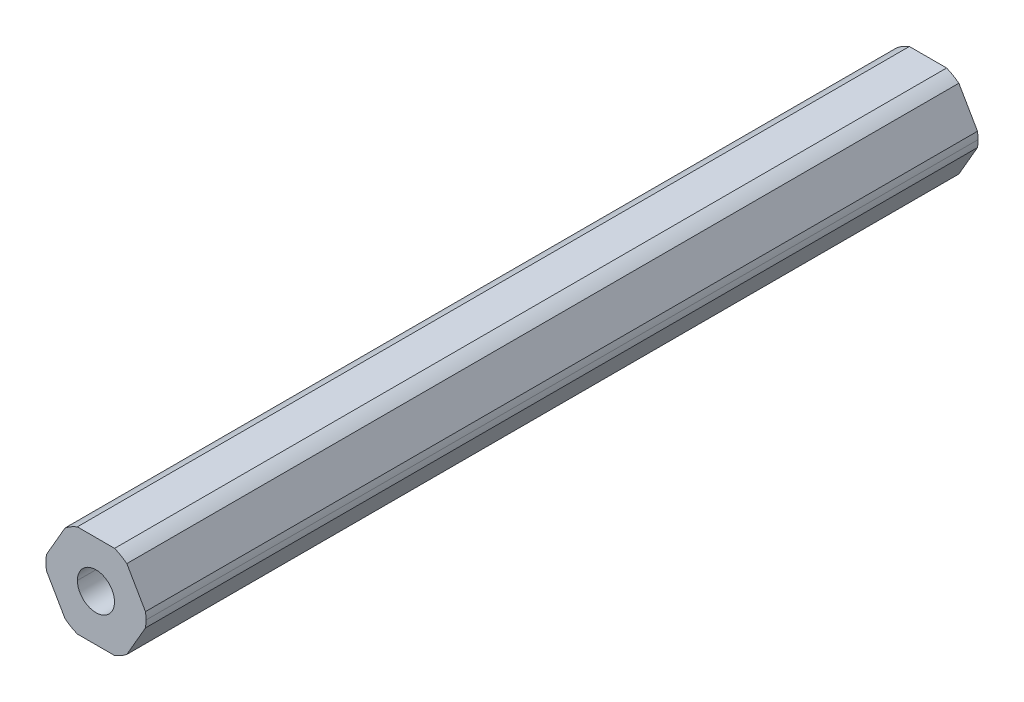
ISO-10303-21;
HEADER;
FILE_DESCRIPTION(('STEP AP214'),'2;1');
FILE_NAME('part.step','',(''),(''),'','','');
FILE_SCHEMA(('AUTOMOTIVE_DESIGN { 1 0 10303 214 1 1 1 1 }'));
ENDSEC;
DATA;
#1=APPLICATION_CONTEXT('core data for automotive mechanical design processes');
#2=APPLICATION_PROTOCOL_DEFINITION('international standard','automotive_design',2000,#1);
#3=PRODUCT_CONTEXT('',#1,'mechanical');
#4=PRODUCT('Part','Part','',(#3));
#5=PRODUCT_RELATED_PRODUCT_CATEGORY('part','',(#4));
#6=PRODUCT_DEFINITION_FORMATION('','',#4);
#7=PRODUCT_DEFINITION_CONTEXT('part definition',#1,'design');
#8=PRODUCT_DEFINITION('design','',#6,#7);
#9=PRODUCT_DEFINITION_SHAPE('','',#8);
#10=(LENGTH_UNIT() NAMED_UNIT(*) SI_UNIT(.MILLI.,.METRE.));
#11=(NAMED_UNIT(*) PLANE_ANGLE_UNIT() SI_UNIT($,.RADIAN.));
#12=(NAMED_UNIT(*) SI_UNIT($,.STERADIAN.) SOLID_ANGLE_UNIT());
#13=UNCERTAINTY_MEASURE_WITH_UNIT(LENGTH_MEASURE(1.E-05),#10,'distance_accuracy_value','');
#14=(GEOMETRIC_REPRESENTATION_CONTEXT(3) GLOBAL_UNCERTAINTY_ASSIGNED_CONTEXT((#13)) GLOBAL_UNIT_ASSIGNED_CONTEXT((#10,
#11,#12)) REPRESENTATION_CONTEXT('',''));
#15=CARTESIAN_POINT('',(0.,0.,0.));
#16=DIRECTION('',(0.,0.,1.));
#17=DIRECTION('',(1.,0.,0.));
#18=AXIS2_PLACEMENT_3D('',#15,#16,#17);
#19=CARTESIAN_POINT('',(0.,0.,-457.2));
#20=DIRECTION('',(0.,0.,1.));
#21=DIRECTION('',(1.,0.,0.));
#22=AXIS2_PLACEMENT_3D('',#19,#20,#21);
#23=CYLINDRICAL_SURFACE('',#22,2.55);
#24=DIRECTION('',(0.,0.,1.));
#25=VECTOR('',#24,1.);
#26=CARTESIAN_POINT('',(2.55,0.,-457.2));
#27=LINE('',#26,#25);
#28=CARTESIAN_POINT('',(2.55,0.,-457.2));
#29=VERTEX_POINT('',#28);
#30=CARTESIAN_POINT('',(2.55,0.,-342.9));
#31=VERTEX_POINT('',#30);
#32=EDGE_CURVE('E255',#29,#31,#27,.T.);
#33=ORIENTED_EDGE('',*,*,#32,.T.);
#34=CARTESIAN_POINT('',(0.,0.,-342.9));
#35=DIRECTION('',(0.,0.,-1.));
#36=DIRECTION('',(-1.,0.,0.));
#37=AXIS2_PLACEMENT_3D('',#34,#35,#36);
#38=CIRCLE('',#37,2.55);
#39=CARTESIAN_POINT('',(-2.55,0.,-342.9));
#40=VERTEX_POINT('',#39);
#41=EDGE_CURVE('E64',#31,#40,#38,.F.);
#42=ORIENTED_EDGE('',*,*,#41,.T.);
#43=DIRECTION('',(0.,0.,1.));
#44=VECTOR('',#43,1.);
#45=CARTESIAN_POINT('',(-2.55,0.,-457.2));
#46=LINE('',#45,#44);
#47=CARTESIAN_POINT('',(-2.55,0.,-457.2));
#48=VERTEX_POINT('',#47);
#49=EDGE_CURVE('E252',#48,#40,#46,.T.);
#50=ORIENTED_EDGE('',*,*,#49,.F.);
#51=CARTESIAN_POINT('',(0.,0.,-457.2));
#52=DIRECTION('',(0.,0.,1.));
#53=DIRECTION('',(1.,0.,0.));
#54=AXIS2_PLACEMENT_3D('',#51,#52,#53);
#55=CIRCLE('',#54,2.55);
#56=EDGE_CURVE('E50',#29,#48,#55,.T.);
#57=ORIENTED_EDGE('',*,*,#56,.F.);
#58=EDGE_LOOP('',(#33,#42,#50,#57));
#59=FACE_BOUND('',#58,.T.);
#60=ADVANCED_FACE('F42',(#59),#23,.F.);
#61=CARTESIAN_POINT('',(0.,0.,-457.2));
#62=DIRECTION('',(0.,0.,1.));
#63=DIRECTION('',(1.,0.,0.));
#64=AXIS2_PLACEMENT_3D('',#61,#62,#63);
#65=CYLINDRICAL_SURFACE('',#64,6.87);
#66=CARTESIAN_POINT('',(0.,0.,-342.9));
#67=DIRECTION('',(0.,0.,-1.));
#68=DIRECTION('',(-1.,0.,0.));
#69=AXIS2_PLACEMENT_3D('',#66,#67,#68);
#70=CIRCLE('',#69,6.87);
#71=CARTESIAN_POINT('',(4.24149521323254,5.40431479062105,-342.9));
#72=VERTEX_POINT('',#71);
#73=CARTESIAN_POINT('',(2.55952629210953,6.3754,-342.9));
#74=VERTEX_POINT('',#73);
#75=EDGE_CURVE('E161',#72,#74,#70,.F.);
#76=ORIENTED_EDGE('',*,*,#75,.F.);
#77=DIRECTION('',(0.,0.,-1.));
#78=VECTOR('',#77,1.);
#79=CARTESIAN_POINT('',(4.24149521323254,5.40431479062105,-457.2));
#80=LINE('',#79,#78);
#81=CARTESIAN_POINT('',(4.24149521323254,5.40431479062105,-457.2));
#82=VERTEX_POINT('',#81);
#83=EDGE_CURVE('E188',#72,#82,#80,.T.);
#84=ORIENTED_EDGE('',*,*,#83,.T.);
#85=CARTESIAN_POINT('',(0.,0.,-457.2));
#86=DIRECTION('',(0.,0.,1.));
#87=DIRECTION('',(1.,0.,0.));
#88=AXIS2_PLACEMENT_3D('',#85,#86,#87);
#89=CIRCLE('',#88,6.87);
#90=CARTESIAN_POINT('',(2.55952629210952,6.3754,-457.2));
#91=VERTEX_POINT('',#90);
#92=EDGE_CURVE('E184',#82,#91,#89,.T.);
#93=ORIENTED_EDGE('',*,*,#92,.T.);
#94=DIRECTION('',(0.,0.,1.));
#95=VECTOR('',#94,1.);
#96=CARTESIAN_POINT('',(2.55952629210952,6.3754,-457.2));
#97=LINE('',#96,#95);
#98=EDGE_CURVE('E178',#91,#74,#97,.T.);
#99=ORIENTED_EDGE('',*,*,#98,.T.);
#100=EDGE_LOOP('',(#76,#84,#93,#99));
#101=FACE_BOUND('',#100,.T.);
#102=ADVANCED_FACE('F182',(#101),#65,.T.);
#103=CARTESIAN_POINT('',(0.,0.,-457.2));
#104=DIRECTION('',(0.,0.,1.));
#105=DIRECTION('',(1.,0.,0.));
#106=AXIS2_PLACEMENT_3D('',#103,#104,#105);
#107=CYLINDRICAL_SURFACE('',#106,6.87);
#108=CARTESIAN_POINT('',(0.,0.,-342.9));
#109=DIRECTION('',(0.,0.,-1.));
#110=DIRECTION('',(-1.,0.,0.));
#111=AXIS2_PLACEMENT_3D('',#108,#109,#110);
#112=CIRCLE('',#111,6.87);
#113=CARTESIAN_POINT('',(-2.55952629210953,6.3754,-342.9));
#114=VERTEX_POINT('',#113);
#115=CARTESIAN_POINT('',(-4.24149521323254,5.40431479062105,-342.9));
#116=VERTEX_POINT('',#115);
#117=EDGE_CURVE('E314',#114,#116,#112,.F.);
#118=ORIENTED_EDGE('',*,*,#117,.F.);
#119=DIRECTION('',(0.,0.,-1.));
#120=VECTOR('',#119,1.);
#121=CARTESIAN_POINT('',(-2.55952629210953,6.3754,-457.2));
#122=LINE('',#121,#120);
#123=CARTESIAN_POINT('',(-2.55952629210953,6.3754,-457.2));
#124=VERTEX_POINT('',#123);
#125=EDGE_CURVE('E179',#114,#124,#122,.T.);
#126=ORIENTED_EDGE('',*,*,#125,.T.);
#127=CARTESIAN_POINT('',(0.,0.,-457.2));
#128=DIRECTION('',(0.,0.,1.));
#129=DIRECTION('',(1.,0.,0.));
#130=AXIS2_PLACEMENT_3D('',#127,#128,#129);
#131=CIRCLE('',#130,6.87);
#132=CARTESIAN_POINT('',(-4.24149521323255,5.40431479062105,-457.2));
#133=VERTEX_POINT('',#132);
#134=EDGE_CURVE('E290',#124,#133,#131,.T.);
#135=ORIENTED_EDGE('',*,*,#134,.T.);
#136=DIRECTION('',(0.,0.,1.));
#137=VECTOR('',#136,1.);
#138=CARTESIAN_POINT('',(-4.24149521323255,5.40431479062105,-457.2));
#139=LINE('',#138,#137);
#140=EDGE_CURVE('E201',#133,#116,#139,.T.);
#141=ORIENTED_EDGE('',*,*,#140,.T.);
#142=EDGE_LOOP('',(#118,#126,#135,#141));
#143=FACE_BOUND('',#142,.T.);
#144=ADVANCED_FACE('F359',(#143),#107,.T.);
#145=CARTESIAN_POINT('',(0.,0.,-457.2));
#146=DIRECTION('',(0.,0.,1.));
#147=DIRECTION('',(1.,0.,0.));
#148=AXIS2_PLACEMENT_3D('',#145,#146,#147);
#149=CYLINDRICAL_SURFACE('',#148,6.87);
#150=CARTESIAN_POINT('',(0.,0.,-342.9));
#151=DIRECTION('',(0.,0.,-1.));
#152=DIRECTION('',(-1.,0.,0.));
#153=AXIS2_PLACEMENT_3D('',#150,#151,#152);
#154=CIRCLE('',#153,6.87);
#155=CARTESIAN_POINT('',(-6.80102150534207,0.97108520937896,-342.9));
#156=VERTEX_POINT('',#155);
#157=CARTESIAN_POINT('',(-6.80102150534208,-0.971085209378956,-342.9));
#158=VERTEX_POINT('',#157);
#159=EDGE_CURVE('E316',#156,#158,#154,.F.);
#160=ORIENTED_EDGE('',*,*,#159,.F.);
#161=DIRECTION('',(0.,0.,-1.));
#162=VECTOR('',#161,1.);
#163=CARTESIAN_POINT('',(-6.80102150534208,0.97108520937896,-457.2));
#164=LINE('',#163,#162);
#165=CARTESIAN_POINT('',(-6.80102150534208,0.97108520937896,-457.2));
#166=VERTEX_POINT('',#165);
#167=EDGE_CURVE('E206',#156,#166,#164,.T.);
#168=ORIENTED_EDGE('',*,*,#167,.T.);
#169=CARTESIAN_POINT('',(0.,0.,-457.2));
#170=DIRECTION('',(0.,0.,1.));
#171=DIRECTION('',(1.,0.,0.));
#172=AXIS2_PLACEMENT_3D('',#169,#170,#171);
#173=CIRCLE('',#172,6.87);
#174=CARTESIAN_POINT('',(-6.80102150534208,-0.971085209378956,-457.2));
#175=VERTEX_POINT('',#174);
#176=EDGE_CURVE('E248',#166,#175,#173,.T.);
#177=ORIENTED_EDGE('',*,*,#176,.T.);
#178=DIRECTION('',(0.,0.,1.));
#179=VECTOR('',#178,1.);
#180=CARTESIAN_POINT('',(-6.80102150534208,-0.971085209378962,-457.2));
#181=LINE('',#180,#179);
#182=EDGE_CURVE('E202',#175,#158,#181,.T.);
#183=ORIENTED_EDGE('',*,*,#182,.T.);
#184=EDGE_LOOP('',(#160,#168,#177,#183));
#185=FACE_BOUND('',#184,.T.);
#186=ADVANCED_FACE('F303',(#185),#149,.T.);
#187=CARTESIAN_POINT('',(0.,0.,-457.2));
#188=DIRECTION('',(0.,0.,1.));
#189=DIRECTION('',(1.,0.,0.));
#190=AXIS2_PLACEMENT_3D('',#187,#188,#189);
#191=CYLINDRICAL_SURFACE('',#190,6.87);
#192=CARTESIAN_POINT('',(0.,0.,-342.9));
#193=DIRECTION('',(0.,0.,-1.));
#194=DIRECTION('',(-1.,0.,0.));
#195=AXIS2_PLACEMENT_3D('',#192,#193,#194);
#196=CIRCLE('',#195,6.87);
#197=CARTESIAN_POINT('',(-4.24149521323254,-5.40431479062105,-342.9));
#198=VERTEX_POINT('',#197);
#199=CARTESIAN_POINT('',(-2.55952629210953,-6.3754,-342.9));
#200=VERTEX_POINT('',#199);
#201=EDGE_CURVE('E253',#198,#200,#196,.F.);
#202=ORIENTED_EDGE('',*,*,#201,.F.);
#203=DIRECTION('',(0.,0.,-1.));
#204=VECTOR('',#203,1.);
#205=CARTESIAN_POINT('',(-4.24149521323255,-5.40431479062104,-457.2));
#206=LINE('',#205,#204);
#207=CARTESIAN_POINT('',(-4.24149521323254,-5.40431479062105,-457.2));
#208=VERTEX_POINT('',#207);
#209=EDGE_CURVE('E244',#198,#208,#206,.T.);
#210=ORIENTED_EDGE('',*,*,#209,.T.);
#211=CARTESIAN_POINT('',(0.,0.,-457.2));
#212=DIRECTION('',(0.,0.,1.));
#213=DIRECTION('',(1.,0.,0.));
#214=AXIS2_PLACEMENT_3D('',#211,#212,#213);
#215=CIRCLE('',#214,6.87);
#216=CARTESIAN_POINT('',(-2.55952629210953,-6.3754,-457.2));
#217=VERTEX_POINT('',#216);
#218=EDGE_CURVE('E245',#208,#217,#215,.T.);
#219=ORIENTED_EDGE('',*,*,#218,.T.);
#220=DIRECTION('',(0.,0.,1.));
#221=VECTOR('',#220,1.);
#222=CARTESIAN_POINT('',(-2.55952629210953,-6.3754,-457.2));
#223=LINE('',#222,#221);
#224=EDGE_CURVE('E235',#217,#200,#223,.T.);
#225=ORIENTED_EDGE('',*,*,#224,.T.);
#226=EDGE_LOOP('',(#202,#210,#219,#225));
#227=FACE_BOUND('',#226,.T.);
#228=ADVANCED_FACE('F338',(#227),#191,.T.);
#229=CARTESIAN_POINT('',(0.,0.,-457.2));
#230=DIRECTION('',(0.,0.,1.));
#231=DIRECTION('',(1.,0.,0.));
#232=AXIS2_PLACEMENT_3D('',#229,#230,#231);
#233=CYLINDRICAL_SURFACE('',#232,6.87);
#234=CARTESIAN_POINT('',(0.,0.,-342.9));
#235=DIRECTION('',(0.,0.,-1.));
#236=DIRECTION('',(-1.,0.,0.));
#237=AXIS2_PLACEMENT_3D('',#234,#235,#236);
#238=CIRCLE('',#237,6.87);
#239=CARTESIAN_POINT('',(2.55952629210953,-6.3754,-342.9));
#240=VERTEX_POINT('',#239);
#241=CARTESIAN_POINT('',(4.24149521323254,-5.40431479062105,-342.9));
#242=VERTEX_POINT('',#241);
#243=EDGE_CURVE('E323',#240,#242,#238,.F.);
#244=ORIENTED_EDGE('',*,*,#243,.F.);
#245=DIRECTION('',(0.,0.,-1.));
#246=VECTOR('',#245,1.);
#247=CARTESIAN_POINT('',(2.55952629210953,-6.3754,-457.2));
#248=LINE('',#247,#246);
#249=CARTESIAN_POINT('',(2.55952629210953,-6.3754,-457.2));
#250=VERTEX_POINT('',#249);
#251=EDGE_CURVE('E234',#240,#250,#248,.T.);
#252=ORIENTED_EDGE('',*,*,#251,.T.);
#253=CARTESIAN_POINT('',(0.,0.,-457.2));
#254=DIRECTION('',(0.,0.,1.));
#255=DIRECTION('',(1.,0.,0.));
#256=AXIS2_PLACEMENT_3D('',#253,#254,#255);
#257=CIRCLE('',#256,6.87);
#258=CARTESIAN_POINT('',(4.24149521323254,-5.40431479062105,-457.2));
#259=VERTEX_POINT('',#258);
#260=EDGE_CURVE('E209',#250,#259,#257,.T.);
#261=ORIENTED_EDGE('',*,*,#260,.T.);
#262=DIRECTION('',(0.,0.,1.));
#263=VECTOR('',#262,1.);
#264=CARTESIAN_POINT('',(4.24149521323255,-5.40431479062104,-457.2));
#265=LINE('',#264,#263);
#266=EDGE_CURVE('E284',#259,#242,#265,.T.);
#267=ORIENTED_EDGE('',*,*,#266,.T.);
#268=EDGE_LOOP('',(#244,#252,#261,#267));
#269=FACE_BOUND('',#268,.T.);
#270=ADVANCED_FACE('F344',(#269),#233,.T.);
#271=CARTESIAN_POINT('',(0.,0.,-457.2));
#272=DIRECTION('',(0.,0.,1.));
#273=DIRECTION('',(1.,0.,0.));
#274=AXIS2_PLACEMENT_3D('',#271,#272,#273);
#275=CYLINDRICAL_SURFACE('',#274,6.87);
#276=CARTESIAN_POINT('',(0.,0.,-342.9));
#277=DIRECTION('',(0.,0.,-1.));
#278=DIRECTION('',(-1.,0.,0.));
#279=AXIS2_PLACEMENT_3D('',#276,#277,#278);
#280=CIRCLE('',#279,6.87);
#281=CARTESIAN_POINT('',(6.87,0.,-342.9));
#282=VERTEX_POINT('',#281);
#283=CARTESIAN_POINT('',(6.80102150534208,0.97108520937895,-342.9));
#284=VERTEX_POINT('',#283);
#285=EDGE_CURVE('E325',#282,#284,#280,.F.);
#286=ORIENTED_EDGE('',*,*,#285,.F.);
#287=DIRECTION('',(0.,0.,1.));
#288=VECTOR('',#287,1.);
#289=CARTESIAN_POINT('',(6.87,0.,-457.2));
#290=LINE('',#289,#288);
#291=CARTESIAN_POINT('',(6.87,0.,-457.2));
#292=VERTEX_POINT('',#291);
#293=EDGE_CURVE('E264',#292,#282,#290,.T.);
#294=ORIENTED_EDGE('',*,*,#293,.F.);
#295=CARTESIAN_POINT('',(0.,0.,-457.2));
#296=DIRECTION('',(0.,0.,1.));
#297=DIRECTION('',(1.,0.,0.));
#298=AXIS2_PLACEMENT_3D('',#295,#296,#297);
#299=CIRCLE('',#298,6.87);
#300=CARTESIAN_POINT('',(6.80102150534208,0.97108520937895,-457.2));
#301=VERTEX_POINT('',#300);
#302=EDGE_CURVE('E207',#292,#301,#299,.T.);
#303=ORIENTED_EDGE('',*,*,#302,.T.);
#304=DIRECTION('',(0.,0.,1.));
#305=VECTOR('',#304,1.);
#306=CARTESIAN_POINT('',(6.80102150534208,0.971085209378949,-457.2));
#307=LINE('',#306,#305);
#308=EDGE_CURVE('E240',#301,#284,#307,.T.);
#309=ORIENTED_EDGE('',*,*,#308,.T.);
#310=EDGE_LOOP('',(#286,#294,#303,#309));
#311=FACE_BOUND('',#310,.T.);
#312=ADVANCED_FACE('F353',(#311),#275,.T.);
#313=CARTESIAN_POINT('',(0.,0.,-457.2));
#314=DIRECTION('',(0.,0.,1.));
#315=DIRECTION('',(1.,0.,0.));
#316=AXIS2_PLACEMENT_3D('',#313,#314,#315);
#317=PLANE('',#316);
#318=ORIENTED_EDGE('',*,*,#56,.T.);
#319=CARTESIAN_POINT('',(0.,0.,-457.2));
#320=DIRECTION('',(0.,0.,1.));
#321=DIRECTION('',(1.,0.,0.));
#322=AXIS2_PLACEMENT_3D('',#319,#320,#321);
#323=CIRCLE('',#322,2.55);
#324=EDGE_CURVE('E249',#48,#29,#323,.T.);
#325=ORIENTED_EDGE('',*,*,#324,.T.);
#326=EDGE_LOOP('',(#318,#325));
#327=FACE_BOUND('',#326,.T.);
#328=ORIENTED_EDGE('',*,*,#92,.F.);
#329=DIRECTION('',(-0.5,0.866025403784439,0.));
#330=VECTOR('',#329,1.);
#331=CARTESIAN_POINT('',(7.36167781238308,0.,-457.2));
#332=LINE('',#331,#330);
#333=EDGE_CURVE('E195',#301,#82,#332,.T.);
#334=ORIENTED_EDGE('',*,*,#333,.F.);
#335=ORIENTED_EDGE('',*,*,#302,.F.);
#336=CARTESIAN_POINT('',(0.,0.,-457.2));
#337=DIRECTION('',(0.,0.,1.));
#338=DIRECTION('',(1.,0.,0.));
#339=AXIS2_PLACEMENT_3D('',#336,#337,#338);
#340=CIRCLE('',#339,6.87);
#341=CARTESIAN_POINT('',(6.80102150534208,-0.971085209378955,-457.2));
#342=VERTEX_POINT('',#341);
#343=EDGE_CURVE('E258',#342,#292,#340,.T.);
#344=ORIENTED_EDGE('',*,*,#343,.F.);
#345=DIRECTION('',(0.5,0.866025403784439,0.));
#346=VECTOR('',#345,1.);
#347=CARTESIAN_POINT('',(3.68083890619154,-6.3754,-457.2));
#348=LINE('',#347,#346);
#349=EDGE_CURVE('E278',#259,#342,#348,.T.);
#350=ORIENTED_EDGE('',*,*,#349,.F.);
#351=ORIENTED_EDGE('',*,*,#260,.F.);
#352=DIRECTION('',(1.,0.,0.));
#353=VECTOR('',#352,1.);
#354=CARTESIAN_POINT('',(-3.68083890619154,-6.3754,-457.2));
#355=LINE('',#354,#353);
#356=EDGE_CURVE('E231',#217,#250,#355,.T.);
#357=ORIENTED_EDGE('',*,*,#356,.F.);
#358=ORIENTED_EDGE('',*,*,#218,.F.);
#359=DIRECTION('',(0.5,-0.866025403784439,0.));
#360=VECTOR('',#359,1.);
#361=CARTESIAN_POINT('',(-7.36167781238308,0.,-457.2));
#362=LINE('',#361,#360);
#363=EDGE_CURVE('E205',#175,#208,#362,.T.);
#364=ORIENTED_EDGE('',*,*,#363,.F.);
#365=ORIENTED_EDGE('',*,*,#176,.F.);
#366=DIRECTION('',(-0.5,-0.866025403784439,0.));
#367=VECTOR('',#366,1.);
#368=CARTESIAN_POINT('',(-3.68083890619154,6.3754,-457.2));
#369=LINE('',#368,#367);
#370=EDGE_CURVE('E212',#133,#166,#369,.T.);
#371=ORIENTED_EDGE('',*,*,#370,.F.);
#372=ORIENTED_EDGE('',*,*,#134,.F.);
#373=DIRECTION('',(-1.,0.,0.));
#374=VECTOR('',#373,1.);
#375=CARTESIAN_POINT('',(3.68083890619154,6.3754,-457.2));
#376=LINE('',#375,#374);
#377=EDGE_CURVE('E187',#91,#124,#376,.T.);
#378=ORIENTED_EDGE('',*,*,#377,.F.);
#379=EDGE_LOOP('',(#328,#334,#335,#344,#350,#351,#357,#358,#364,#365,#371,#372,#378));
#380=FACE_BOUND('',#379,.T.);
#381=ADVANCED_FACE('F307',(#327,#380),#317,.F.);
#382=CARTESIAN_POINT('',(-3.68083890619154,-6.3754,457.2));
#383=DIRECTION('',(0.,1.,0.));
#384=DIRECTION('',(1.,0.,0.));
#385=AXIS2_PLACEMENT_3D('',#382,#383,#384);
#386=PLANE('',#385);
#387=ORIENTED_EDGE('',*,*,#251,.F.);
#388=DIRECTION('',(-1.,0.,0.));
#389=VECTOR('',#388,1.);
#390=CARTESIAN_POINT('',(-23.0653966837621,-6.3754,-342.9));
#391=LINE('',#390,#389);
#392=EDGE_CURVE('E180',#240,#200,#391,.T.);
#393=ORIENTED_EDGE('',*,*,#392,.T.);
#394=ORIENTED_EDGE('',*,*,#224,.F.);
#395=ORIENTED_EDGE('',*,*,#356,.T.);
#396=EDGE_LOOP('',(#387,#393,#394,#395));
#397=FACE_BOUND('',#396,.T.);
#398=ADVANCED_FACE('F335',(#397),#386,.F.);
#399=CARTESIAN_POINT('',(-7.36167781238308,0.,457.2));
#400=DIRECTION('',(0.866025403784439,0.5,0.));
#401=DIRECTION('',(0.,0.,-1.));
#402=AXIS2_PLACEMENT_3D('',#399,#400,#401);
#403=PLANE('',#402);
#404=ORIENTED_EDGE('',*,*,#209,.F.);
#405=DIRECTION('',(-0.5,0.866025403784439,0.));
#406=VECTOR('',#405,1.);
#407=CARTESIAN_POINT('',(-7.36167781238308,0.,-342.9));
#408=LINE('',#407,#406);
#409=EDGE_CURVE('E312',#198,#158,#408,.T.);
#410=ORIENTED_EDGE('',*,*,#409,.T.);
#411=ORIENTED_EDGE('',*,*,#182,.F.);
#412=ORIENTED_EDGE('',*,*,#363,.T.);
#413=EDGE_LOOP('',(#404,#410,#411,#412));
#414=FACE_BOUND('',#413,.T.);
#415=ADVANCED_FACE('F44',(#414),#403,.F.);
#416=CARTESIAN_POINT('',(-3.68083890619154,6.3754,457.2));
#417=DIRECTION('',(0.866025403784439,-0.5,0.));
#418=DIRECTION('',(0.,0.,-1.));
#419=AXIS2_PLACEMENT_3D('',#416,#417,#418);
#420=PLANE('',#419);
#421=ORIENTED_EDGE('',*,*,#167,.F.);
#422=DIRECTION('',(0.5,0.866025403784439,0.));
#423=VECTOR('',#422,1.);
#424=CARTESIAN_POINT('',(-3.68083890619154,6.3754,-342.9));
#425=LINE('',#424,#423);
#426=EDGE_CURVE('E171',#156,#116,#425,.T.);
#427=ORIENTED_EDGE('',*,*,#426,.T.);
#428=ORIENTED_EDGE('',*,*,#140,.F.);
#429=ORIENTED_EDGE('',*,*,#370,.T.);
#430=EDGE_LOOP('',(#421,#427,#428,#429));
#431=FACE_BOUND('',#430,.T.);
#432=ADVANCED_FACE('F360',(#431),#420,.F.);
#433=CARTESIAN_POINT('',(3.68083890619154,6.3754,457.2));
#434=DIRECTION('',(0.,-1.,0.));
#435=DIRECTION('',(0.,0.,-1.));
#436=AXIS2_PLACEMENT_3D('',#433,#434,#435);
#437=PLANE('',#436);
#438=ORIENTED_EDGE('',*,*,#125,.F.);
#439=DIRECTION('',(-1.,0.,0.));
#440=VECTOR('',#439,1.);
#441=CARTESIAN_POINT('',(-23.0653966837621,6.3754,-342.9));
#442=LINE('',#441,#440);
#443=EDGE_CURVE('E164',#74,#114,#442,.T.);
#444=ORIENTED_EDGE('',*,*,#443,.F.);
#445=ORIENTED_EDGE('',*,*,#98,.F.);
#446=ORIENTED_EDGE('',*,*,#377,.T.);
#447=EDGE_LOOP('',(#438,#444,#445,#446));
#448=FACE_BOUND('',#447,.T.);
#449=ADVANCED_FACE('F176',(#448),#437,.F.);
#450=CARTESIAN_POINT('',(7.36167781238308,0.,457.2));
#451=DIRECTION('',(-0.866025403784439,-0.5,0.));
#452=DIRECTION('',(-0.5,0.866025403784439,0.));
#453=AXIS2_PLACEMENT_3D('',#450,#451,#452);
#454=PLANE('',#453);
#455=ORIENTED_EDGE('',*,*,#83,.F.);
#456=DIRECTION('',(0.5,-0.866025403784439,0.));
#457=VECTOR('',#456,1.);
#458=CARTESIAN_POINT('',(7.36167781238308,0.,-342.9));
#459=LINE('',#458,#457);
#460=EDGE_CURVE('E167',#72,#284,#459,.T.);
#461=ORIENTED_EDGE('',*,*,#460,.T.);
#462=ORIENTED_EDGE('',*,*,#308,.F.);
#463=ORIENTED_EDGE('',*,*,#333,.T.);
#464=EDGE_LOOP('',(#455,#461,#462,#463));
#465=FACE_BOUND('',#464,.T.);
#466=ADVANCED_FACE('F357',(#465),#454,.F.);
#467=CARTESIAN_POINT('',(3.68083890619154,-6.3754,457.2));
#468=DIRECTION('',(-0.866025403784439,0.5,0.));
#469=DIRECTION('',(0.,0.,1.));
#470=AXIS2_PLACEMENT_3D('',#467,#468,#469);
#471=PLANE('',#470);
#472=DIRECTION('',(0.,0.,-1.));
#473=VECTOR('',#472,1.);
#474=CARTESIAN_POINT('',(6.80102150534208,-0.971085209378962,-457.2));
#475=LINE('',#474,#473);
#476=CARTESIAN_POINT('',(6.80102150534208,-0.971085209378962,-342.9));
#477=VERTEX_POINT('',#476);
#478=EDGE_CURVE('E229',#477,#342,#475,.T.);
#479=ORIENTED_EDGE('',*,*,#478,.F.);
#480=DIRECTION('',(-0.5,-0.866025403784439,0.));
#481=VECTOR('',#480,1.);
#482=CARTESIAN_POINT('',(3.68083890619154,-6.3754,-342.9));
#483=LINE('',#482,#481);
#484=EDGE_CURVE('E57',#477,#242,#483,.T.);
#485=ORIENTED_EDGE('',*,*,#484,.T.);
#486=ORIENTED_EDGE('',*,*,#266,.F.);
#487=ORIENTED_EDGE('',*,*,#349,.T.);
#488=EDGE_LOOP('',(#479,#485,#486,#487));
#489=FACE_BOUND('',#488,.T.);
#490=ADVANCED_FACE('F347',(#489),#471,.F.);
#491=CARTESIAN_POINT('',(0.,0.,-457.2));
#492=DIRECTION('',(0.,0.,1.));
#493=DIRECTION('',(1.,0.,0.));
#494=AXIS2_PLACEMENT_3D('',#491,#492,#493);
#495=CYLINDRICAL_SURFACE('',#494,6.87);
#496=CARTESIAN_POINT('',(0.,0.,-342.9));
#497=DIRECTION('',(0.,0.,-1.));
#498=DIRECTION('',(-1.,0.,0.));
#499=AXIS2_PLACEMENT_3D('',#496,#497,#498);
#500=CIRCLE('',#499,6.87);
#501=EDGE_CURVE('E328',#477,#282,#500,.F.);
#502=ORIENTED_EDGE('',*,*,#501,.F.);
#503=ORIENTED_EDGE('',*,*,#478,.T.);
#504=ORIENTED_EDGE('',*,*,#343,.T.);
#505=ORIENTED_EDGE('',*,*,#293,.T.);
#506=EDGE_LOOP('',(#502,#503,#504,#505));
#507=FACE_BOUND('',#506,.T.);
#508=ADVANCED_FACE('F349',(#507),#495,.T.);
#509=CARTESIAN_POINT('',(0.,0.,-457.2));
#510=DIRECTION('',(0.,0.,1.));
#511=DIRECTION('',(1.,0.,0.));
#512=AXIS2_PLACEMENT_3D('',#509,#510,#511);
#513=CYLINDRICAL_SURFACE('',#512,2.55);
#514=ORIENTED_EDGE('',*,*,#49,.T.);
#515=CARTESIAN_POINT('',(0.,0.,-342.9));
#516=DIRECTION('',(0.,0.,-1.));
#517=DIRECTION('',(-1.,0.,0.));
#518=AXIS2_PLACEMENT_3D('',#515,#516,#517);
#519=CIRCLE('',#518,2.55);
#520=EDGE_CURVE('E11',#40,#31,#519,.F.);
#521=ORIENTED_EDGE('',*,*,#520,.T.);
#522=ORIENTED_EDGE('',*,*,#32,.F.);
#523=ORIENTED_EDGE('',*,*,#324,.F.);
#524=EDGE_LOOP('',(#514,#521,#522,#523));
#525=FACE_BOUND('',#524,.T.);
#526=ADVANCED_FACE('F376',(#525),#513,.F.);
#527=CARTESIAN_POINT('',(-23.0653966837621,-6.3754,-342.9));
#528=DIRECTION('',(0.,0.,-1.));
#529=DIRECTION('',(-1.,0.,0.));
#530=AXIS2_PLACEMENT_3D('',#527,#528,#529);
#531=PLANE('',#530);
#532=ORIENTED_EDGE('',*,*,#201,.T.);
#533=ORIENTED_EDGE('',*,*,#392,.F.);
#534=ORIENTED_EDGE('',*,*,#243,.T.);
#535=ORIENTED_EDGE('',*,*,#484,.F.);
#536=ORIENTED_EDGE('',*,*,#501,.T.);
#537=ORIENTED_EDGE('',*,*,#285,.T.);
#538=ORIENTED_EDGE('',*,*,#460,.F.);
#539=ORIENTED_EDGE('',*,*,#75,.T.);
#540=ORIENTED_EDGE('',*,*,#443,.T.);
#541=ORIENTED_EDGE('',*,*,#117,.T.);
#542=ORIENTED_EDGE('',*,*,#426,.F.);
#543=ORIENTED_EDGE('',*,*,#159,.T.);
#544=ORIENTED_EDGE('',*,*,#409,.F.);
#545=EDGE_LOOP('',(#532,#533,#534,#535,#536,#537,#538,#539,#540,#541,#542,#543,#544));
#546=FACE_BOUND('',#545,.T.);
#547=ORIENTED_EDGE('',*,*,#520,.F.);
#548=ORIENTED_EDGE('',*,*,#41,.F.);
#549=EDGE_LOOP('',(#547,#548));
#550=FACE_BOUND('',#549,.T.);
#551=ADVANCED_FACE('F163',(#546,#550),#531,.F.);
#552=CLOSED_SHELL('',(#60,#102,#144,#186,#228,#270,#312,#381,#398,#415,#432,#449,#466,#490,#508,
#526,#551));
#553=MANIFOLD_SOLID_BREP('B2',#552);
#554=ADVANCED_BREP_SHAPE_REPRESENTATION('',(#18,#553),#14);
#555=SHAPE_DEFINITION_REPRESENTATION(#9,#554);
ENDSEC;
END-ISO-10303-21;
